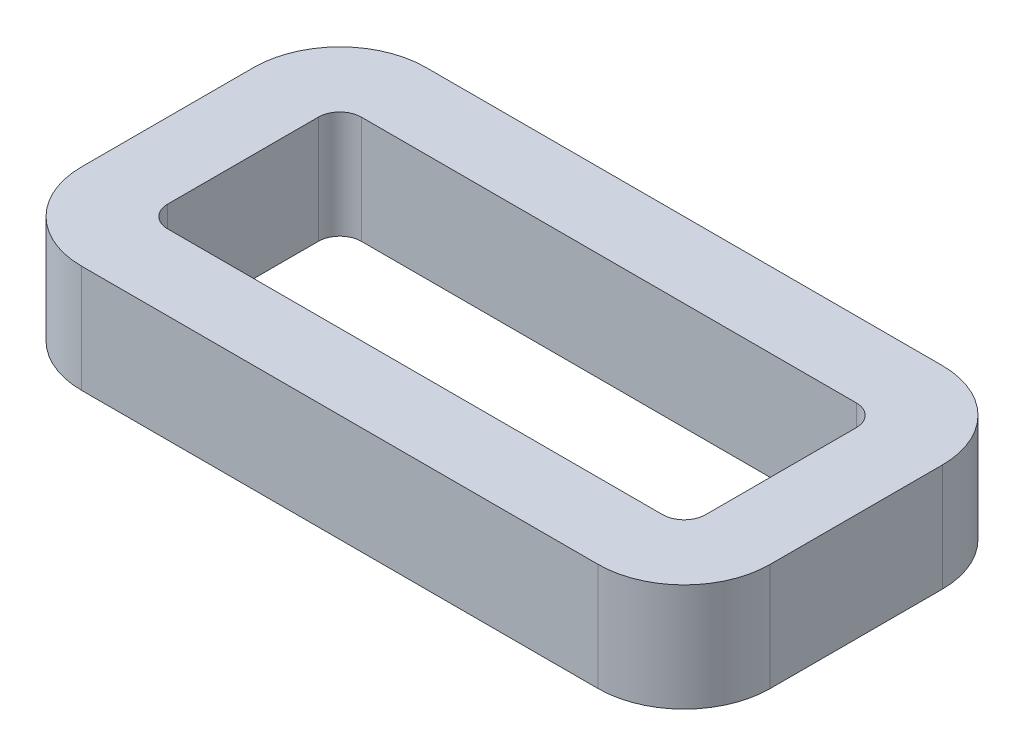
ISO-10303-21;
HEADER;
FILE_DESCRIPTION(('STEP AP214'),'2;1');
FILE_NAME('part.step','',(''),(''),'','','');
FILE_SCHEMA(('AUTOMOTIVE_DESIGN { 1 0 10303 214 1 1 1 1 }'));
ENDSEC;
DATA;
#1=APPLICATION_CONTEXT('core data for automotive mechanical design processes');
#2=APPLICATION_PROTOCOL_DEFINITION('international standard','automotive_design',2000,#1);
#3=PRODUCT_CONTEXT('',#1,'mechanical');
#4=PRODUCT('Part','Part','',(#3));
#5=PRODUCT_RELATED_PRODUCT_CATEGORY('part','',(#4));
#6=PRODUCT_DEFINITION_FORMATION('','',#4);
#7=PRODUCT_DEFINITION_CONTEXT('part definition',#1,'design');
#8=PRODUCT_DEFINITION('design','',#6,#7);
#9=PRODUCT_DEFINITION_SHAPE('','',#8);
#10=(LENGTH_UNIT() NAMED_UNIT(*) SI_UNIT(.MILLI.,.METRE.));
#11=(NAMED_UNIT(*) PLANE_ANGLE_UNIT() SI_UNIT($,.RADIAN.));
#12=(NAMED_UNIT(*) SI_UNIT($,.STERADIAN.) SOLID_ANGLE_UNIT());
#13=UNCERTAINTY_MEASURE_WITH_UNIT(LENGTH_MEASURE(1.E-05),#10,'distance_accuracy_value','');
#14=(GEOMETRIC_REPRESENTATION_CONTEXT(3) GLOBAL_UNCERTAINTY_ASSIGNED_CONTEXT((#13)) GLOBAL_UNIT_ASSIGNED_CONTEXT((#10,
#11,#12)) REPRESENTATION_CONTEXT('',''));
#15=CARTESIAN_POINT('',(0.,0.,0.));
#16=DIRECTION('',(0.,0.,1.));
#17=DIRECTION('',(1.,0.,0.));
#18=AXIS2_PLACEMENT_3D('',#15,#16,#17);
#19=CARTESIAN_POINT('',(2.,-1.25,-6.));
#20=DIRECTION('',(0.,1.,0.));
#21=DIRECTION('',(0.,0.,1.));
#22=AXIS2_PLACEMENT_3D('',#19,#20,#21);
#23=CYLINDRICAL_SURFACE('',#22,2.);
#24=DIRECTION('',(0.,1.,0.));
#25=VECTOR('',#24,1.);
#26=CARTESIAN_POINT('',(0.,-1.25,-5.99999999999999));
#27=LINE('',#26,#25);
#28=CARTESIAN_POINT('',(0.,-1.25,-5.99999999999999));
#29=VERTEX_POINT('',#28);
#30=CARTESIAN_POINT('',(0.,1.25,-5.99999999999999));
#31=VERTEX_POINT('',#30);
#32=EDGE_CURVE('E36',#29,#31,#27,.T.);
#33=ORIENTED_EDGE('',*,*,#32,.T.);
#34=CARTESIAN_POINT('',(2.,1.25,-6.));
#35=DIRECTION('',(0.,1.,0.));
#36=DIRECTION('',(0.,0.,-1.));
#37=AXIS2_PLACEMENT_3D('',#34,#35,#36);
#38=CIRCLE('',#37,2.);
#39=CARTESIAN_POINT('',(2.00000000000001,1.25,-8.));
#40=VERTEX_POINT('',#39);
#41=EDGE_CURVE('E189',#40,#31,#38,.T.);
#42=ORIENTED_EDGE('',*,*,#41,.F.);
#43=DIRECTION('',(0.,1.,0.));
#44=VECTOR('',#43,1.);
#45=CARTESIAN_POINT('',(2.00000000000001,-1.25,-8.));
#46=LINE('',#45,#44);
#47=CARTESIAN_POINT('',(2.00000000000001,-1.25,-8.));
#48=VERTEX_POINT('',#47);
#49=EDGE_CURVE('E11',#48,#40,#46,.T.);
#50=ORIENTED_EDGE('',*,*,#49,.F.);
#51=CARTESIAN_POINT('',(2.,-1.25,-6.));
#52=DIRECTION('',(0.,1.,0.));
#53=DIRECTION('',(0.,0.,-1.));
#54=AXIS2_PLACEMENT_3D('',#51,#52,#53);
#55=CIRCLE('',#54,2.);
#56=EDGE_CURVE('E232',#48,#29,#55,.T.);
#57=ORIENTED_EDGE('',*,*,#56,.T.);
#58=EDGE_LOOP('',(#33,#42,#50,#57));
#59=FACE_BOUND('',#58,.T.);
#60=ADVANCED_FACE('F33',(#59),#23,.T.);
#61=CARTESIAN_POINT('',(2.00000000000001,-1.25,-8.));
#62=DIRECTION('',(0.,0.,-1.));
#63=DIRECTION('',(-1.,0.,0.));
#64=AXIS2_PLACEMENT_3D('',#61,#62,#63);
#65=PLANE('',#64);
#66=ORIENTED_EDGE('',*,*,#49,.T.);
#67=DIRECTION('',(-1.,0.,0.));
#68=VECTOR('',#67,1.);
#69=CARTESIAN_POINT('',(2.00000000000001,1.25,-8.));
#70=LINE('',#69,#68);
#71=CARTESIAN_POINT('',(14.,1.25,-8.));
#72=VERTEX_POINT('',#71);
#73=EDGE_CURVE('E210',#72,#40,#70,.T.);
#74=ORIENTED_EDGE('',*,*,#73,.F.);
#75=DIRECTION('',(0.,1.,0.));
#76=VECTOR('',#75,1.);
#77=CARTESIAN_POINT('',(14.,-1.25,-8.));
#78=LINE('',#77,#76);
#79=CARTESIAN_POINT('',(14.,-1.25,-8.));
#80=VERTEX_POINT('',#79);
#81=EDGE_CURVE('E41',#80,#72,#78,.T.);
#82=ORIENTED_EDGE('',*,*,#81,.F.);
#83=DIRECTION('',(-1.,0.,0.));
#84=VECTOR('',#83,1.);
#85=CARTESIAN_POINT('',(2.00000000000001,-1.25,-8.));
#86=LINE('',#85,#84);
#87=EDGE_CURVE('E263',#80,#48,#86,.T.);
#88=ORIENTED_EDGE('',*,*,#87,.T.);
#89=EDGE_LOOP('',(#66,#74,#82,#88));
#90=FACE_BOUND('',#89,.T.);
#91=ADVANCED_FACE('F284',(#90),#65,.T.);
#92=CARTESIAN_POINT('',(14.,-1.25,-6.));
#93=DIRECTION('',(0.,1.,0.));
#94=DIRECTION('',(0.,0.,1.));
#95=AXIS2_PLACEMENT_3D('',#92,#93,#94);
#96=CYLINDRICAL_SURFACE('',#95,2.);
#97=ORIENTED_EDGE('',*,*,#81,.T.);
#98=CARTESIAN_POINT('',(14.,1.25,-6.));
#99=DIRECTION('',(0.,1.,0.));
#100=DIRECTION('',(0.,0.,-1.));
#101=AXIS2_PLACEMENT_3D('',#98,#99,#100);
#102=CIRCLE('',#101,2.);
#103=CARTESIAN_POINT('',(16.,1.25,-5.99999999999999));
#104=VERTEX_POINT('',#103);
#105=EDGE_CURVE('E207',#104,#72,#102,.T.);
#106=ORIENTED_EDGE('',*,*,#105,.F.);
#107=DIRECTION('',(0.,1.,0.));
#108=VECTOR('',#107,1.);
#109=CARTESIAN_POINT('',(16.,-1.25,-5.99999999999999));
#110=LINE('',#109,#108);
#111=CARTESIAN_POINT('',(16.,-1.25,-5.99999999999999));
#112=VERTEX_POINT('',#111);
#113=EDGE_CURVE('E267',#112,#104,#110,.T.);
#114=ORIENTED_EDGE('',*,*,#113,.F.);
#115=CARTESIAN_POINT('',(14.,-1.25,-6.));
#116=DIRECTION('',(0.,1.,0.));
#117=DIRECTION('',(0.,0.,-1.));
#118=AXIS2_PLACEMENT_3D('',#115,#116,#117);
#119=CIRCLE('',#118,2.);
#120=EDGE_CURVE('E260',#112,#80,#119,.T.);
#121=ORIENTED_EDGE('',*,*,#120,.T.);
#122=EDGE_LOOP('',(#97,#106,#114,#121));
#123=FACE_BOUND('',#122,.T.);
#124=ADVANCED_FACE('F305',(#123),#96,.T.);
#125=CARTESIAN_POINT('',(16.,-1.25,-2.00000000000001));
#126=DIRECTION('',(1.,0.,0.));
#127=DIRECTION('',(0.,0.,-1.));
#128=AXIS2_PLACEMENT_3D('',#125,#126,#127);
#129=PLANE('',#128);
#130=ORIENTED_EDGE('',*,*,#113,.T.);
#131=DIRECTION('',(0.,0.,-1.));
#132=VECTOR('',#131,1.);
#133=CARTESIAN_POINT('',(16.,1.25,-2.00000000000001));
#134=LINE('',#133,#132);
#135=CARTESIAN_POINT('',(16.,1.25,-2.00000000000001));
#136=VERTEX_POINT('',#135);
#137=EDGE_CURVE('E204',#136,#104,#134,.T.);
#138=ORIENTED_EDGE('',*,*,#137,.F.);
#139=DIRECTION('',(0.,1.,0.));
#140=VECTOR('',#139,1.);
#141=CARTESIAN_POINT('',(16.,-1.25,-2.00000000000001));
#142=LINE('',#141,#140);
#143=CARTESIAN_POINT('',(16.,-1.25,-2.00000000000001));
#144=VERTEX_POINT('',#143);
#145=EDGE_CURVE('E269',#144,#136,#142,.T.);
#146=ORIENTED_EDGE('',*,*,#145,.F.);
#147=DIRECTION('',(0.,0.,-1.));
#148=VECTOR('',#147,1.);
#149=CARTESIAN_POINT('',(16.,-1.25,-2.00000000000001));
#150=LINE('',#149,#148);
#151=EDGE_CURVE('E257',#144,#112,#150,.T.);
#152=ORIENTED_EDGE('',*,*,#151,.T.);
#153=EDGE_LOOP('',(#130,#138,#146,#152));
#154=FACE_BOUND('',#153,.T.);
#155=ADVANCED_FACE('F302',(#154),#129,.T.);
#156=CARTESIAN_POINT('',(14.,-1.25,-2.));
#157=DIRECTION('',(0.,1.,0.));
#158=DIRECTION('',(0.,0.,1.));
#159=AXIS2_PLACEMENT_3D('',#156,#157,#158);
#160=CYLINDRICAL_SURFACE('',#159,2.);
#161=ORIENTED_EDGE('',*,*,#145,.T.);
#162=CARTESIAN_POINT('',(14.,1.25,-2.));
#163=DIRECTION('',(0.,1.,0.));
#164=DIRECTION('',(0.,0.,1.));
#165=AXIS2_PLACEMENT_3D('',#162,#163,#164);
#166=CIRCLE('',#165,2.);
#167=CARTESIAN_POINT('',(14.,1.25,0.));
#168=VERTEX_POINT('',#167);
#169=EDGE_CURVE('E201',#168,#136,#166,.T.);
#170=ORIENTED_EDGE('',*,*,#169,.F.);
#171=DIRECTION('',(0.,1.,0.));
#172=VECTOR('',#171,1.);
#173=CARTESIAN_POINT('',(14.,-1.25,0.));
#174=LINE('',#173,#172);
#175=CARTESIAN_POINT('',(14.,-1.25,0.));
#176=VERTEX_POINT('',#175);
#177=EDGE_CURVE('E271',#176,#168,#174,.T.);
#178=ORIENTED_EDGE('',*,*,#177,.F.);
#179=CARTESIAN_POINT('',(14.,-1.25,-2.));
#180=DIRECTION('',(0.,1.,0.));
#181=DIRECTION('',(0.,0.,1.));
#182=AXIS2_PLACEMENT_3D('',#179,#180,#181);
#183=CIRCLE('',#182,2.);
#184=EDGE_CURVE('E254',#176,#144,#183,.T.);
#185=ORIENTED_EDGE('',*,*,#184,.T.);
#186=EDGE_LOOP('',(#161,#170,#178,#185));
#187=FACE_BOUND('',#186,.T.);
#188=ADVANCED_FACE('F300',(#187),#160,.T.);
#189=CARTESIAN_POINT('',(2.00000000000001,-1.25,0.));
#190=DIRECTION('',(0.,0.,1.));
#191=DIRECTION('',(1.,0.,0.));
#192=AXIS2_PLACEMENT_3D('',#189,#190,#191);
#193=PLANE('',#192);
#194=ORIENTED_EDGE('',*,*,#177,.T.);
#195=DIRECTION('',(1.,0.,0.));
#196=VECTOR('',#195,1.);
#197=CARTESIAN_POINT('',(2.00000000000001,1.25,0.));
#198=LINE('',#197,#196);
#199=CARTESIAN_POINT('',(2.00000000000001,1.25,0.));
#200=VERTEX_POINT('',#199);
#201=EDGE_CURVE('E198',#200,#168,#198,.T.);
#202=ORIENTED_EDGE('',*,*,#201,.F.);
#203=DIRECTION('',(0.,1.,0.));
#204=VECTOR('',#203,1.);
#205=CARTESIAN_POINT('',(2.00000000000001,-1.25,0.));
#206=LINE('',#205,#204);
#207=CARTESIAN_POINT('',(2.00000000000001,-1.25,0.));
#208=VERTEX_POINT('',#207);
#209=EDGE_CURVE('E273',#208,#200,#206,.T.);
#210=ORIENTED_EDGE('',*,*,#209,.F.);
#211=DIRECTION('',(1.,0.,0.));
#212=VECTOR('',#211,1.);
#213=CARTESIAN_POINT('',(2.00000000000001,-1.25,0.));
#214=LINE('',#213,#212);
#215=EDGE_CURVE('E251',#208,#176,#214,.T.);
#216=ORIENTED_EDGE('',*,*,#215,.T.);
#217=EDGE_LOOP('',(#194,#202,#210,#216));
#218=FACE_BOUND('',#217,.T.);
#219=ADVANCED_FACE('F298',(#218),#193,.T.);
#220=CARTESIAN_POINT('',(2.,-1.25,-2.));
#221=DIRECTION('',(0.,1.,0.));
#222=DIRECTION('',(0.,0.,1.));
#223=AXIS2_PLACEMENT_3D('',#220,#221,#222);
#224=CYLINDRICAL_SURFACE('',#223,2.);
#225=ORIENTED_EDGE('',*,*,#209,.T.);
#226=CARTESIAN_POINT('',(2.,1.25,-2.));
#227=DIRECTION('',(0.,1.,0.));
#228=DIRECTION('',(0.,0.,-1.));
#229=AXIS2_PLACEMENT_3D('',#226,#227,#228);
#230=CIRCLE('',#229,2.);
#231=CARTESIAN_POINT('',(0.,1.25,-2.00000000000001));
#232=VERTEX_POINT('',#231);
#233=EDGE_CURVE('E195',#232,#200,#230,.T.);
#234=ORIENTED_EDGE('',*,*,#233,.F.);
#235=DIRECTION('',(0.,1.,0.));
#236=VECTOR('',#235,1.);
#237=CARTESIAN_POINT('',(0.,-1.25,-2.00000000000001));
#238=LINE('',#237,#236);
#239=CARTESIAN_POINT('',(0.,-1.25,-2.00000000000001));
#240=VERTEX_POINT('',#239);
#241=EDGE_CURVE('E274',#240,#232,#238,.T.);
#242=ORIENTED_EDGE('',*,*,#241,.F.);
#243=CARTESIAN_POINT('',(2.,-1.25,-2.));
#244=DIRECTION('',(0.,1.,0.));
#245=DIRECTION('',(0.,0.,-1.));
#246=AXIS2_PLACEMENT_3D('',#243,#244,#245);
#247=CIRCLE('',#246,2.);
#248=EDGE_CURVE('E248',#240,#208,#247,.T.);
#249=ORIENTED_EDGE('',*,*,#248,.T.);
#250=EDGE_LOOP('',(#225,#234,#242,#249));
#251=FACE_BOUND('',#250,.T.);
#252=ADVANCED_FACE('F294',(#251),#224,.T.);
#253=CARTESIAN_POINT('',(0.,-1.25,-2.00000000000001));
#254=DIRECTION('',(-1.,0.,0.));
#255=DIRECTION('',(0.,0.,1.));
#256=AXIS2_PLACEMENT_3D('',#253,#254,#255);
#257=PLANE('',#256);
#258=ORIENTED_EDGE('',*,*,#241,.T.);
#259=DIRECTION('',(0.,0.,1.));
#260=VECTOR('',#259,1.);
#261=CARTESIAN_POINT('',(0.,1.25,-2.00000000000001));
#262=LINE('',#261,#260);
#263=EDGE_CURVE('E192',#31,#232,#262,.T.);
#264=ORIENTED_EDGE('',*,*,#263,.F.);
#265=ORIENTED_EDGE('',*,*,#32,.F.);
#266=DIRECTION('',(0.,0.,1.));
#267=VECTOR('',#266,1.);
#268=CARTESIAN_POINT('',(0.,-1.25,-2.00000000000001));
#269=LINE('',#268,#267);
#270=EDGE_CURVE('E245',#29,#240,#269,.T.);
#271=ORIENTED_EDGE('',*,*,#270,.T.);
#272=EDGE_LOOP('',(#258,#264,#265,#271));
#273=FACE_BOUND('',#272,.T.);
#274=ADVANCED_FACE('F278',(#273),#257,.T.);
#275=CARTESIAN_POINT('',(2.,-1.25,-6.));
#276=DIRECTION('',(0.,-1.,0.));
#277=DIRECTION('',(0.,0.,-1.));
#278=AXIS2_PLACEMENT_3D('',#275,#276,#277);
#279=PLANE('',#278);
#280=CARTESIAN_POINT('',(2.25,-1.25,-5.75));
#281=DIRECTION('',(0.,1.,0.));
#282=DIRECTION('',(0.,0.,-1.));
#283=AXIS2_PLACEMENT_3D('',#280,#281,#282);
#284=CIRCLE('',#283,0.5);
#285=CARTESIAN_POINT('',(2.25,-1.25,-6.25));
#286=VERTEX_POINT('',#285);
#287=CARTESIAN_POINT('',(1.75,-1.25,-5.75));
#288=VERTEX_POINT('',#287);
#289=EDGE_CURVE('E213',#286,#288,#284,.T.);
#290=ORIENTED_EDGE('',*,*,#289,.T.);
#291=DIRECTION('',(0.,0.,1.));
#292=VECTOR('',#291,1.);
#293=CARTESIAN_POINT('',(1.75,-1.25,-5.75));
#294=LINE('',#293,#292);
#295=CARTESIAN_POINT('',(1.75,-1.25,-2.25));
#296=VERTEX_POINT('',#295);
#297=EDGE_CURVE('E153',#288,#296,#294,.T.);
#298=ORIENTED_EDGE('',*,*,#297,.T.);
#299=CARTESIAN_POINT('',(2.25,-1.25,-2.25));
#300=DIRECTION('',(0.,1.,0.));
#301=DIRECTION('',(0.,0.,1.));
#302=AXIS2_PLACEMENT_3D('',#299,#300,#301);
#303=CIRCLE('',#302,0.5);
#304=CARTESIAN_POINT('',(2.25,-1.25,-1.75));
#305=VERTEX_POINT('',#304);
#306=EDGE_CURVE('E49',#296,#305,#303,.T.);
#307=ORIENTED_EDGE('',*,*,#306,.T.);
#308=DIRECTION('',(1.,0.,0.));
#309=VECTOR('',#308,1.);
#310=CARTESIAN_POINT('',(2.25,-1.25,-1.75));
#311=LINE('',#310,#309);
#312=CARTESIAN_POINT('',(13.75,-1.25,-1.75));
#313=VERTEX_POINT('',#312);
#314=EDGE_CURVE('E217',#305,#313,#311,.T.);
#315=ORIENTED_EDGE('',*,*,#314,.T.);
#316=CARTESIAN_POINT('',(13.75,-1.25,-2.25));
#317=DIRECTION('',(0.,1.,0.));
#318=DIRECTION('',(0.,0.,-1.));
#319=AXIS2_PLACEMENT_3D('',#316,#317,#318);
#320=CIRCLE('',#319,0.5);
#321=CARTESIAN_POINT('',(14.25,-1.25,-2.25));
#322=VERTEX_POINT('',#321);
#323=EDGE_CURVE('E220',#313,#322,#320,.T.);
#324=ORIENTED_EDGE('',*,*,#323,.T.);
#325=DIRECTION('',(0.,0.,-1.));
#326=VECTOR('',#325,1.);
#327=CARTESIAN_POINT('',(14.25,-1.25,-2.25));
#328=LINE('',#327,#326);
#329=CARTESIAN_POINT('',(14.25,-1.25,-5.75));
#330=VERTEX_POINT('',#329);
#331=EDGE_CURVE('E223',#322,#330,#328,.T.);
#332=ORIENTED_EDGE('',*,*,#331,.T.);
#333=CARTESIAN_POINT('',(13.75,-1.25,-5.75));
#334=DIRECTION('',(0.,1.,0.));
#335=DIRECTION('',(0.,0.,-1.));
#336=AXIS2_PLACEMENT_3D('',#333,#334,#335);
#337=CIRCLE('',#336,0.5);
#338=CARTESIAN_POINT('',(13.75,-1.25,-6.25));
#339=VERTEX_POINT('',#338);
#340=EDGE_CURVE('E226',#330,#339,#337,.T.);
#341=ORIENTED_EDGE('',*,*,#340,.T.);
#342=DIRECTION('',(-1.,0.,0.));
#343=VECTOR('',#342,1.);
#344=CARTESIAN_POINT('',(2.25,-1.25,-6.25));
#345=LINE('',#344,#343);
#346=EDGE_CURVE('E158',#339,#286,#345,.T.);
#347=ORIENTED_EDGE('',*,*,#346,.T.);
#348=EDGE_LOOP('',(#290,#298,#307,#315,#324,#332,#341,#347));
#349=FACE_BOUND('',#348,.T.);
#350=ORIENTED_EDGE('',*,*,#56,.F.);
#351=ORIENTED_EDGE('',*,*,#87,.F.);
#352=ORIENTED_EDGE('',*,*,#120,.F.);
#353=ORIENTED_EDGE('',*,*,#151,.F.);
#354=ORIENTED_EDGE('',*,*,#184,.F.);
#355=ORIENTED_EDGE('',*,*,#215,.F.);
#356=ORIENTED_EDGE('',*,*,#248,.F.);
#357=ORIENTED_EDGE('',*,*,#270,.F.);
#358=EDGE_LOOP('',(#350,#351,#352,#353,#354,#355,#356,#357));
#359=FACE_BOUND('',#358,.T.);
#360=ADVANCED_FACE('F288',(#349,#359),#279,.T.);
#361=CARTESIAN_POINT('',(2.25,-1.25,-5.75));
#362=DIRECTION('',(0.,1.,0.));
#363=DIRECTION('',(0.,0.,1.));
#364=AXIS2_PLACEMENT_3D('',#361,#362,#363);
#365=CYLINDRICAL_SURFACE('',#364,0.5);
#366=DIRECTION('',(0.,1.,0.));
#367=VECTOR('',#366,1.);
#368=CARTESIAN_POINT('',(2.25,-1.25,-6.25));
#369=LINE('',#368,#367);
#370=CARTESIAN_POINT('',(2.25,1.25,-6.25));
#371=VERTEX_POINT('',#370);
#372=EDGE_CURVE('E163',#286,#371,#369,.T.);
#373=ORIENTED_EDGE('',*,*,#372,.T.);
#374=CARTESIAN_POINT('',(2.25,1.25,-5.75));
#375=DIRECTION('',(0.,1.,0.));
#376=DIRECTION('',(0.,0.,-1.));
#377=AXIS2_PLACEMENT_3D('',#374,#375,#376);
#378=CIRCLE('',#377,0.5);
#379=CARTESIAN_POINT('',(1.75,1.25,-5.75));
#380=VERTEX_POINT('',#379);
#381=EDGE_CURVE('E161',#371,#380,#378,.T.);
#382=ORIENTED_EDGE('',*,*,#381,.T.);
#383=DIRECTION('',(0.,1.,0.));
#384=VECTOR('',#383,1.);
#385=CARTESIAN_POINT('',(1.75,-1.25,-5.75));
#386=LINE('',#385,#384);
#387=EDGE_CURVE('E146',#288,#380,#386,.T.);
#388=ORIENTED_EDGE('',*,*,#387,.F.);
#389=ORIENTED_EDGE('',*,*,#289,.F.);
#390=EDGE_LOOP('',(#373,#382,#388,#389));
#391=FACE_BOUND('',#390,.T.);
#392=ADVANCED_FACE('F162',(#391),#365,.F.);
#393=CARTESIAN_POINT('',(2.25,-1.25,-6.25));
#394=DIRECTION('',(0.,0.,-1.));
#395=DIRECTION('',(-1.,0.,0.));
#396=AXIS2_PLACEMENT_3D('',#393,#394,#395);
#397=PLANE('',#396);
#398=DIRECTION('',(0.,1.,0.));
#399=VECTOR('',#398,1.);
#400=CARTESIAN_POINT('',(13.75,-1.25,-6.25));
#401=LINE('',#400,#399);
#402=CARTESIAN_POINT('',(13.75,1.25,-6.25));
#403=VERTEX_POINT('',#402);
#404=EDGE_CURVE('E233',#339,#403,#401,.T.);
#405=ORIENTED_EDGE('',*,*,#404,.T.);
#406=DIRECTION('',(-1.,0.,0.));
#407=VECTOR('',#406,1.);
#408=CARTESIAN_POINT('',(2.25,1.25,-6.25));
#409=LINE('',#408,#407);
#410=EDGE_CURVE('E187',#403,#371,#409,.T.);
#411=ORIENTED_EDGE('',*,*,#410,.T.);
#412=ORIENTED_EDGE('',*,*,#372,.F.);
#413=ORIENTED_EDGE('',*,*,#346,.F.);
#414=EDGE_LOOP('',(#405,#411,#412,#413));
#415=FACE_BOUND('',#414,.T.);
#416=ADVANCED_FACE('F381',(#415),#397,.F.);
#417=CARTESIAN_POINT('',(13.75,-1.25,-5.75));
#418=DIRECTION('',(0.,1.,0.));
#419=DIRECTION('',(0.,0.,1.));
#420=AXIS2_PLACEMENT_3D('',#417,#418,#419);
#421=CYLINDRICAL_SURFACE('',#420,0.5);
#422=DIRECTION('',(0.,1.,0.));
#423=VECTOR('',#422,1.);
#424=CARTESIAN_POINT('',(14.25,-1.25,-5.75));
#425=LINE('',#424,#423);
#426=CARTESIAN_POINT('',(14.25,1.25,-5.75));
#427=VERTEX_POINT('',#426);
#428=EDGE_CURVE('E235',#330,#427,#425,.T.);
#429=ORIENTED_EDGE('',*,*,#428,.T.);
#430=CARTESIAN_POINT('',(13.75,1.25,-5.75));
#431=DIRECTION('',(0.,1.,0.));
#432=DIRECTION('',(0.,0.,-1.));
#433=AXIS2_PLACEMENT_3D('',#430,#431,#432);
#434=CIRCLE('',#433,0.5);
#435=EDGE_CURVE('E184',#427,#403,#434,.T.);
#436=ORIENTED_EDGE('',*,*,#435,.T.);
#437=ORIENTED_EDGE('',*,*,#404,.F.);
#438=ORIENTED_EDGE('',*,*,#340,.F.);
#439=EDGE_LOOP('',(#429,#436,#437,#438));
#440=FACE_BOUND('',#439,.T.);
#441=ADVANCED_FACE('F390',(#440),#421,.F.);
#442=CARTESIAN_POINT('',(14.25,-1.25,-2.25));
#443=DIRECTION('',(1.,0.,0.));
#444=DIRECTION('',(0.,0.,-1.));
#445=AXIS2_PLACEMENT_3D('',#442,#443,#444);
#446=PLANE('',#445);
#447=DIRECTION('',(0.,1.,0.));
#448=VECTOR('',#447,1.);
#449=CARTESIAN_POINT('',(14.25,-1.25,-2.25));
#450=LINE('',#449,#448);
#451=CARTESIAN_POINT('',(14.25,1.25,-2.25));
#452=VERTEX_POINT('',#451);
#453=EDGE_CURVE('E237',#322,#452,#450,.T.);
#454=ORIENTED_EDGE('',*,*,#453,.T.);
#455=DIRECTION('',(0.,0.,-1.));
#456=VECTOR('',#455,1.);
#457=CARTESIAN_POINT('',(14.25,1.25,-2.25));
#458=LINE('',#457,#456);
#459=EDGE_CURVE('E181',#452,#427,#458,.T.);
#460=ORIENTED_EDGE('',*,*,#459,.T.);
#461=ORIENTED_EDGE('',*,*,#428,.F.);
#462=ORIENTED_EDGE('',*,*,#331,.F.);
#463=EDGE_LOOP('',(#454,#460,#461,#462));
#464=FACE_BOUND('',#463,.T.);
#465=ADVANCED_FACE('F400',(#464),#446,.F.);
#466=CARTESIAN_POINT('',(13.75,-1.25,-2.25));
#467=DIRECTION('',(0.,1.,0.));
#468=DIRECTION('',(0.,0.,1.));
#469=AXIS2_PLACEMENT_3D('',#466,#467,#468);
#470=CYLINDRICAL_SURFACE('',#469,0.5);
#471=DIRECTION('',(0.,1.,0.));
#472=VECTOR('',#471,1.);
#473=CARTESIAN_POINT('',(13.75,-1.25,-1.75));
#474=LINE('',#473,#472);
#475=CARTESIAN_POINT('',(13.75,1.25,-1.75));
#476=VERTEX_POINT('',#475);
#477=EDGE_CURVE('E239',#313,#476,#474,.T.);
#478=ORIENTED_EDGE('',*,*,#477,.T.);
#479=CARTESIAN_POINT('',(13.75,1.25,-2.25));
#480=DIRECTION('',(0.,1.,0.));
#481=DIRECTION('',(0.,0.,-1.));
#482=AXIS2_PLACEMENT_3D('',#479,#480,#481);
#483=CIRCLE('',#482,0.5);
#484=EDGE_CURVE('E178',#476,#452,#483,.T.);
#485=ORIENTED_EDGE('',*,*,#484,.T.);
#486=ORIENTED_EDGE('',*,*,#453,.F.);
#487=ORIENTED_EDGE('',*,*,#323,.F.);
#488=EDGE_LOOP('',(#478,#485,#486,#487));
#489=FACE_BOUND('',#488,.T.);
#490=ADVANCED_FACE('F410',(#489),#470,.F.);
#491=CARTESIAN_POINT('',(2.25,-1.25,-1.75));
#492=DIRECTION('',(0.,0.,1.));
#493=DIRECTION('',(1.,0.,0.));
#494=AXIS2_PLACEMENT_3D('',#491,#492,#493);
#495=PLANE('',#494);
#496=DIRECTION('',(0.,1.,0.));
#497=VECTOR('',#496,1.);
#498=CARTESIAN_POINT('',(2.25,-1.25,-1.75));
#499=LINE('',#498,#497);
#500=CARTESIAN_POINT('',(2.25,1.25,-1.75));
#501=VERTEX_POINT('',#500);
#502=EDGE_CURVE('E241',#305,#501,#499,.T.);
#503=ORIENTED_EDGE('',*,*,#502,.T.);
#504=DIRECTION('',(1.,0.,0.));
#505=VECTOR('',#504,1.);
#506=CARTESIAN_POINT('',(2.25,1.25,-1.75));
#507=LINE('',#506,#505);
#508=EDGE_CURVE('E173',#501,#476,#507,.T.);
#509=ORIENTED_EDGE('',*,*,#508,.T.);
#510=ORIENTED_EDGE('',*,*,#477,.F.);
#511=ORIENTED_EDGE('',*,*,#314,.F.);
#512=EDGE_LOOP('',(#503,#509,#510,#511));
#513=FACE_BOUND('',#512,.T.);
#514=ADVANCED_FACE('F420',(#513),#495,.F.);
#515=CARTESIAN_POINT('',(2.25,-1.25,-2.25));
#516=DIRECTION('',(0.,1.,0.));
#517=DIRECTION('',(0.,0.,1.));
#518=AXIS2_PLACEMENT_3D('',#515,#516,#517);
#519=CYLINDRICAL_SURFACE('',#518,0.5);
#520=DIRECTION('',(0.,1.,0.));
#521=VECTOR('',#520,1.);
#522=CARTESIAN_POINT('',(1.75,-1.25,-2.25));
#523=LINE('',#522,#521);
#524=CARTESIAN_POINT('',(1.75,1.25,-2.25));
#525=VERTEX_POINT('',#524);
#526=EDGE_CURVE('E157',#296,#525,#523,.T.);
#527=ORIENTED_EDGE('',*,*,#526,.T.);
#528=CARTESIAN_POINT('',(2.25,1.25,-2.25));
#529=DIRECTION('',(0.,1.,0.));
#530=DIRECTION('',(0.,0.,1.));
#531=AXIS2_PLACEMENT_3D('',#528,#529,#530);
#532=CIRCLE('',#531,0.5);
#533=EDGE_CURVE('E171',#525,#501,#532,.T.);
#534=ORIENTED_EDGE('',*,*,#533,.T.);
#535=ORIENTED_EDGE('',*,*,#502,.F.);
#536=ORIENTED_EDGE('',*,*,#306,.F.);
#537=EDGE_LOOP('',(#527,#534,#535,#536));
#538=FACE_BOUND('',#537,.T.);
#539=ADVANCED_FACE('F430',(#538),#519,.F.);
#540=CARTESIAN_POINT('',(1.75,-1.25,-5.75));
#541=DIRECTION('',(-1.,0.,0.));
#542=DIRECTION('',(0.,0.,1.));
#543=AXIS2_PLACEMENT_3D('',#540,#541,#542);
#544=PLANE('',#543);
#545=ORIENTED_EDGE('',*,*,#387,.T.);
#546=DIRECTION('',(0.,0.,1.));
#547=VECTOR('',#546,1.);
#548=CARTESIAN_POINT('',(1.75,1.25,-5.75));
#549=LINE('',#548,#547);
#550=EDGE_CURVE('E150',#380,#525,#549,.T.);
#551=ORIENTED_EDGE('',*,*,#550,.T.);
#552=ORIENTED_EDGE('',*,*,#526,.F.);
#553=ORIENTED_EDGE('',*,*,#297,.F.);
#554=EDGE_LOOP('',(#545,#551,#552,#553));
#555=FACE_BOUND('',#554,.T.);
#556=ADVANCED_FACE('F148',(#555),#544,.F.);
#557=CARTESIAN_POINT('',(2.,1.25,-6.));
#558=DIRECTION('',(0.,-1.,0.));
#559=DIRECTION('',(0.,0.,-1.));
#560=AXIS2_PLACEMENT_3D('',#557,#558,#559);
#561=PLANE('',#560);
#562=ORIENTED_EDGE('',*,*,#41,.T.);
#563=ORIENTED_EDGE('',*,*,#263,.T.);
#564=ORIENTED_EDGE('',*,*,#233,.T.);
#565=ORIENTED_EDGE('',*,*,#201,.T.);
#566=ORIENTED_EDGE('',*,*,#169,.T.);
#567=ORIENTED_EDGE('',*,*,#137,.T.);
#568=ORIENTED_EDGE('',*,*,#105,.T.);
#569=ORIENTED_EDGE('',*,*,#73,.T.);
#570=EDGE_LOOP('',(#562,#563,#564,#565,#566,#567,#568,#569));
#571=FACE_BOUND('',#570,.T.);
#572=ORIENTED_EDGE('',*,*,#381,.F.);
#573=ORIENTED_EDGE('',*,*,#410,.F.);
#574=ORIENTED_EDGE('',*,*,#435,.F.);
#575=ORIENTED_EDGE('',*,*,#459,.F.);
#576=ORIENTED_EDGE('',*,*,#484,.F.);
#577=ORIENTED_EDGE('',*,*,#508,.F.);
#578=ORIENTED_EDGE('',*,*,#533,.F.);
#579=ORIENTED_EDGE('',*,*,#550,.F.);
#580=EDGE_LOOP('',(#572,#573,#574,#575,#576,#577,#578,#579));
#581=FACE_BOUND('',#580,.T.);
#582=ADVANCED_FACE('F168',(#571,#581),#561,.F.);
#583=CLOSED_SHELL('',(#60,#91,#124,#155,#188,#219,#252,#274,#360,#392,#416,#441,#465,#490,#514,
#539,#556,#582));
#584=MANIFOLD_SOLID_BREP('B2',#583);
#585=ADVANCED_BREP_SHAPE_REPRESENTATION('',(#18,#584),#14);
#586=SHAPE_DEFINITION_REPRESENTATION(#9,#585);
ENDSEC;
END-ISO-10303-21;
